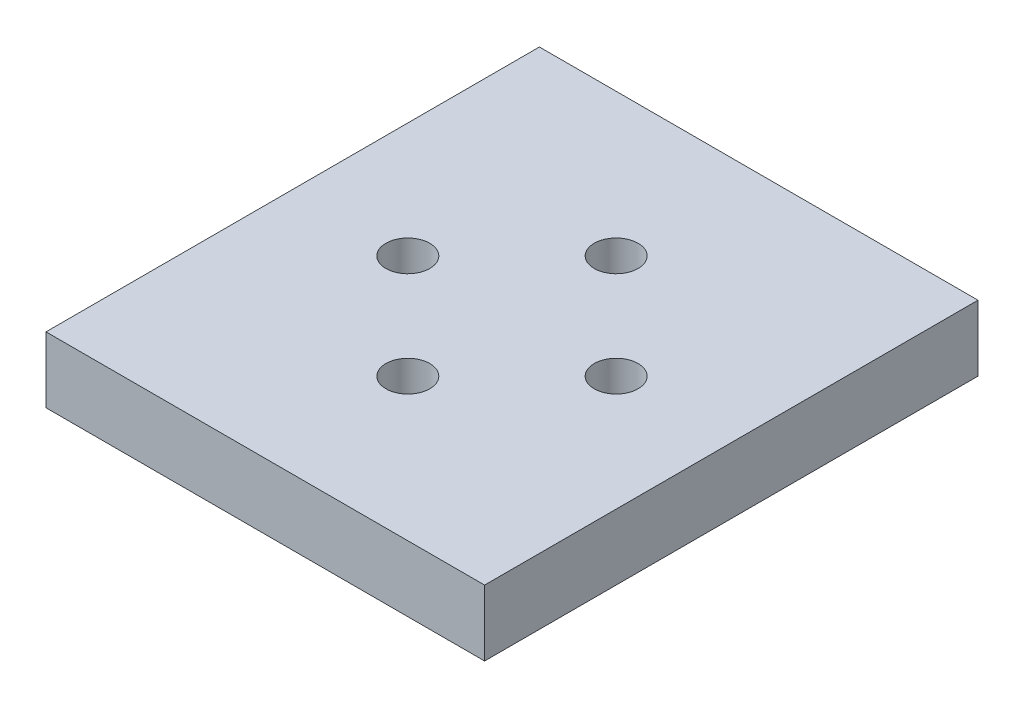
ISO-10303-21;
HEADER;
FILE_DESCRIPTION(('STEP AP214'),'2;1');
FILE_NAME('part.step','',(''),(''),'','','');
FILE_SCHEMA(('AUTOMOTIVE_DESIGN { 1 0 10303 214 1 1 1 1 }'));
ENDSEC;
DATA;
#1=APPLICATION_CONTEXT('core data for automotive mechanical design processes');
#2=APPLICATION_PROTOCOL_DEFINITION('international standard','automotive_design',2000,#1);
#3=PRODUCT_CONTEXT('',#1,'mechanical');
#4=PRODUCT('Part','Part','',(#3));
#5=PRODUCT_RELATED_PRODUCT_CATEGORY('part','',(#4));
#6=PRODUCT_DEFINITION_FORMATION('','',#4);
#7=PRODUCT_DEFINITION_CONTEXT('part definition',#1,'design');
#8=PRODUCT_DEFINITION('design','',#6,#7);
#9=PRODUCT_DEFINITION_SHAPE('','',#8);
#10=(LENGTH_UNIT() NAMED_UNIT(*) SI_UNIT(.MILLI.,.METRE.));
#11=(NAMED_UNIT(*) PLANE_ANGLE_UNIT() SI_UNIT($,.RADIAN.));
#12=(NAMED_UNIT(*) SI_UNIT($,.STERADIAN.) SOLID_ANGLE_UNIT());
#13=UNCERTAINTY_MEASURE_WITH_UNIT(LENGTH_MEASURE(1.E-05),#10,'distance_accuracy_value','');
#14=(GEOMETRIC_REPRESENTATION_CONTEXT(3) GLOBAL_UNCERTAINTY_ASSIGNED_CONTEXT((#13)) GLOBAL_UNIT_ASSIGNED_CONTEXT((#10,
#11,#12)) REPRESENTATION_CONTEXT('',''));
#15=CARTESIAN_POINT('',(0.,0.,0.));
#16=DIRECTION('',(0.,0.,1.));
#17=DIRECTION('',(1.,0.,0.));
#18=AXIS2_PLACEMENT_3D('',#15,#16,#17);
#19=CARTESIAN_POINT('',(20.,6.,-22.5));
#20=DIRECTION('',(-1.,0.,0.));
#21=DIRECTION('',(0.,0.,1.));
#22=AXIS2_PLACEMENT_3D('',#19,#20,#21);
#23=PLANE('',#22);
#24=DIRECTION('',(0.,0.,-1.));
#25=VECTOR('',#24,1.);
#26=CARTESIAN_POINT('',(20.,0.,-22.5));
#27=LINE('',#26,#25);
#28=CARTESIAN_POINT('',(20.,0.,22.5));
#29=VERTEX_POINT('',#28);
#30=CARTESIAN_POINT('',(20.,0.,-22.5));
#31=VERTEX_POINT('',#30);
#32=EDGE_CURVE('E96',#29,#31,#27,.T.);
#33=ORIENTED_EDGE('',*,*,#32,.T.);
#34=DIRECTION('',(0.,-1.,0.));
#35=VECTOR('',#34,1.);
#36=CARTESIAN_POINT('',(20.,6.,-22.5));
#37=LINE('',#36,#35);
#38=CARTESIAN_POINT('',(20.,6.,-22.5));
#39=VERTEX_POINT('',#38);
#40=EDGE_CURVE('E11',#39,#31,#37,.T.);
#41=ORIENTED_EDGE('',*,*,#40,.F.);
#42=DIRECTION('',(0.,0.,-1.));
#43=VECTOR('',#42,1.);
#44=CARTESIAN_POINT('',(20.,6.,-22.5));
#45=LINE('',#44,#43);
#46=CARTESIAN_POINT('',(20.,6.,22.5));
#47=VERTEX_POINT('',#46);
#48=EDGE_CURVE('E84',#47,#39,#45,.T.);
#49=ORIENTED_EDGE('',*,*,#48,.F.);
#50=DIRECTION('',(0.,-1.,0.));
#51=VECTOR('',#50,1.);
#52=CARTESIAN_POINT('',(20.,6.,22.5));
#53=LINE('',#52,#51);
#54=EDGE_CURVE('E92',#47,#29,#53,.T.);
#55=ORIENTED_EDGE('',*,*,#54,.T.);
#56=EDGE_LOOP('',(#33,#41,#49,#55));
#57=FACE_BOUND('',#56,.T.);
#58=ADVANCED_FACE('F33',(#57),#23,.F.);
#59=CARTESIAN_POINT('',(-20.,6.,-22.5));
#60=DIRECTION('',(0.,0.,1.));
#61=DIRECTION('',(1.,0.,0.));
#62=AXIS2_PLACEMENT_3D('',#59,#60,#61);
#63=PLANE('',#62);
#64=DIRECTION('',(-1.,0.,0.));
#65=VECTOR('',#64,1.);
#66=CARTESIAN_POINT('',(-20.,0.,-22.5));
#67=LINE('',#66,#65);
#68=CARTESIAN_POINT('',(-20.,0.,-22.5));
#69=VERTEX_POINT('',#68);
#70=EDGE_CURVE('E88',#31,#69,#67,.T.);
#71=ORIENTED_EDGE('',*,*,#70,.T.);
#72=DIRECTION('',(0.,-1.,0.));
#73=VECTOR('',#72,1.);
#74=CARTESIAN_POINT('',(-20.,6.,-22.5));
#75=LINE('',#74,#73);
#76=CARTESIAN_POINT('',(-20.,6.,-22.5));
#77=VERTEX_POINT('',#76);
#78=EDGE_CURVE('E41',#77,#69,#75,.T.);
#79=ORIENTED_EDGE('',*,*,#78,.F.);
#80=DIRECTION('',(-1.,0.,0.));
#81=VECTOR('',#80,1.);
#82=CARTESIAN_POINT('',(-20.,6.,-22.5));
#83=LINE('',#82,#81);
#84=EDGE_CURVE('E79',#39,#77,#83,.T.);
#85=ORIENTED_EDGE('',*,*,#84,.F.);
#86=ORIENTED_EDGE('',*,*,#40,.T.);
#87=EDGE_LOOP('',(#71,#79,#85,#86));
#88=FACE_BOUND('',#87,.T.);
#89=ADVANCED_FACE('F87',(#88),#63,.F.);
#90=CARTESIAN_POINT('',(-20.,6.,-22.5));
#91=DIRECTION('',(1.,0.,0.));
#92=DIRECTION('',(0.,0.,-1.));
#93=AXIS2_PLACEMENT_3D('',#90,#91,#92);
#94=PLANE('',#93);
#95=DIRECTION('',(0.,0.,1.));
#96=VECTOR('',#95,1.);
#97=CARTESIAN_POINT('',(-20.,0.,-22.5));
#98=LINE('',#97,#96);
#99=CARTESIAN_POINT('',(-20.,0.,22.5));
#100=VERTEX_POINT('',#99);
#101=EDGE_CURVE('E66',#69,#100,#98,.T.);
#102=ORIENTED_EDGE('',*,*,#101,.T.);
#103=DIRECTION('',(0.,-1.,0.));
#104=VECTOR('',#103,1.);
#105=CARTESIAN_POINT('',(-20.,6.,22.5));
#106=LINE('',#105,#104);
#107=CARTESIAN_POINT('',(-20.,6.,22.5));
#108=VERTEX_POINT('',#107);
#109=EDGE_CURVE('E89',#108,#100,#106,.T.);
#110=ORIENTED_EDGE('',*,*,#109,.F.);
#111=DIRECTION('',(0.,0.,1.));
#112=VECTOR('',#111,1.);
#113=CARTESIAN_POINT('',(-20.,6.,-22.5));
#114=LINE('',#113,#112);
#115=EDGE_CURVE('E82',#77,#108,#114,.T.);
#116=ORIENTED_EDGE('',*,*,#115,.F.);
#117=ORIENTED_EDGE('',*,*,#78,.T.);
#118=EDGE_LOOP('',(#102,#110,#116,#117));
#119=FACE_BOUND('',#118,.T.);
#120=ADVANCED_FACE('F90',(#119),#94,.F.);
#121=CARTESIAN_POINT('',(-20.,6.,22.5));
#122=DIRECTION('',(0.,0.,-1.));
#123=DIRECTION('',(-1.,0.,0.));
#124=AXIS2_PLACEMENT_3D('',#121,#122,#123);
#125=PLANE('',#124);
#126=DIRECTION('',(1.,0.,0.));
#127=VECTOR('',#126,1.);
#128=CARTESIAN_POINT('',(-20.,0.,22.5));
#129=LINE('',#128,#127);
#130=EDGE_CURVE('E72',#100,#29,#129,.T.);
#131=ORIENTED_EDGE('',*,*,#130,.T.);
#132=ORIENTED_EDGE('',*,*,#54,.F.);
#133=DIRECTION('',(1.,0.,0.));
#134=VECTOR('',#133,1.);
#135=CARTESIAN_POINT('',(-20.,6.,22.5));
#136=LINE('',#135,#134);
#137=EDGE_CURVE('E49',#108,#47,#136,.T.);
#138=ORIENTED_EDGE('',*,*,#137,.F.);
#139=ORIENTED_EDGE('',*,*,#109,.T.);
#140=EDGE_LOOP('',(#131,#132,#138,#139));
#141=FACE_BOUND('',#140,.T.);
#142=ADVANCED_FACE('F104',(#141),#125,.F.);
#143=CARTESIAN_POINT('',(0.,6.,0.));
#144=DIRECTION('',(0.,1.,0.));
#145=DIRECTION('',(0.,0.,1.));
#146=AXIS2_PLACEMENT_3D('',#143,#144,#145);
#147=PLANE('',#146);
#148=CARTESIAN_POINT('',(-9.49999999999999,6.,0.));
#149=DIRECTION('',(0.,1.,0.));
#150=DIRECTION('',(0.,0.,1.));
#151=AXIS2_PLACEMENT_3D('',#148,#149,#150);
#152=CIRCLE('',#151,2.);
#153=CARTESIAN_POINT('',(-9.49999999999999,6.,2.));
#154=VERTEX_POINT('',#153);
#155=EDGE_CURVE('E128',#154,#154,#152,.T.);
#156=ORIENTED_EDGE('',*,*,#155,.F.);
#157=EDGE_LOOP('',(#156));
#158=FACE_BOUND('',#157,.T.);
#159=CARTESIAN_POINT('',(0.,6.,9.5));
#160=DIRECTION('',(0.,1.,0.));
#161=DIRECTION('',(0.,0.,1.));
#162=AXIS2_PLACEMENT_3D('',#159,#160,#161);
#163=CIRCLE('',#162,2.);
#164=CARTESIAN_POINT('',(0.,6.,11.5));
#165=VERTEX_POINT('',#164);
#166=EDGE_CURVE('E122',#165,#165,#163,.T.);
#167=ORIENTED_EDGE('',*,*,#166,.F.);
#168=EDGE_LOOP('',(#167));
#169=FACE_BOUND('',#168,.T.);
#170=CARTESIAN_POINT('',(9.50000000000001,6.,0.));
#171=DIRECTION('',(0.,1.,0.));
#172=DIRECTION('',(0.,0.,1.));
#173=AXIS2_PLACEMENT_3D('',#170,#171,#172);
#174=CIRCLE('',#173,2.);
#175=CARTESIAN_POINT('',(9.50000000000001,6.,2.));
#176=VERTEX_POINT('',#175);
#177=EDGE_CURVE('E116',#176,#176,#174,.T.);
#178=ORIENTED_EDGE('',*,*,#177,.F.);
#179=EDGE_LOOP('',(#178));
#180=FACE_BOUND('',#179,.T.);
#181=CARTESIAN_POINT('',(0.,6.,-9.5));
#182=DIRECTION('',(0.,1.,0.));
#183=DIRECTION('',(0.,0.,1.));
#184=AXIS2_PLACEMENT_3D('',#181,#182,#183);
#185=CIRCLE('',#184,2.);
#186=CARTESIAN_POINT('',(0.,6.,-7.5));
#187=VERTEX_POINT('',#186);
#188=EDGE_CURVE('E110',#187,#187,#185,.T.);
#189=ORIENTED_EDGE('',*,*,#188,.F.);
#190=EDGE_LOOP('',(#189));
#191=FACE_BOUND('',#190,.T.);
#192=ORIENTED_EDGE('',*,*,#48,.T.);
#193=ORIENTED_EDGE('',*,*,#84,.T.);
#194=ORIENTED_EDGE('',*,*,#115,.T.);
#195=ORIENTED_EDGE('',*,*,#137,.T.);
#196=EDGE_LOOP('',(#192,#193,#194,#195));
#197=FACE_BOUND('',#196,.T.);
#198=ADVANCED_FACE('F80',(#158,#169,#180,#191,#197),#147,.T.);
#199=CARTESIAN_POINT('',(0.,0.,0.));
#200=DIRECTION('',(0.,1.,0.));
#201=DIRECTION('',(0.,0.,1.));
#202=AXIS2_PLACEMENT_3D('',#199,#200,#201);
#203=PLANE('',#202);
#204=CARTESIAN_POINT('',(-9.49999999999999,0.,0.));
#205=DIRECTION('',(0.,1.,0.));
#206=DIRECTION('',(0.,0.,1.));
#207=AXIS2_PLACEMENT_3D('',#204,#205,#206);
#208=CIRCLE('',#207,2.);
#209=CARTESIAN_POINT('',(-9.49999999999999,0.,2.));
#210=VERTEX_POINT('',#209);
#211=EDGE_CURVE('E125',#210,#210,#208,.T.);
#212=ORIENTED_EDGE('',*,*,#211,.T.);
#213=EDGE_LOOP('',(#212));
#214=FACE_BOUND('',#213,.T.);
#215=CARTESIAN_POINT('',(0.,0.,9.5));
#216=DIRECTION('',(0.,1.,0.));
#217=DIRECTION('',(0.,0.,1.));
#218=AXIS2_PLACEMENT_3D('',#215,#216,#217);
#219=CIRCLE('',#218,2.);
#220=CARTESIAN_POINT('',(0.,0.,11.5));
#221=VERTEX_POINT('',#220);
#222=EDGE_CURVE('E119',#221,#221,#219,.T.);
#223=ORIENTED_EDGE('',*,*,#222,.T.);
#224=EDGE_LOOP('',(#223));
#225=FACE_BOUND('',#224,.T.);
#226=CARTESIAN_POINT('',(9.50000000000001,0.,0.));
#227=DIRECTION('',(0.,1.,0.));
#228=DIRECTION('',(0.,0.,1.));
#229=AXIS2_PLACEMENT_3D('',#226,#227,#228);
#230=CIRCLE('',#229,2.);
#231=CARTESIAN_POINT('',(9.50000000000001,0.,2.));
#232=VERTEX_POINT('',#231);
#233=EDGE_CURVE('E113',#232,#232,#230,.T.);
#234=ORIENTED_EDGE('',*,*,#233,.T.);
#235=EDGE_LOOP('',(#234));
#236=FACE_BOUND('',#235,.T.);
#237=CARTESIAN_POINT('',(0.,0.,-9.5));
#238=DIRECTION('',(0.,1.,0.));
#239=DIRECTION('',(0.,0.,1.));
#240=AXIS2_PLACEMENT_3D('',#237,#238,#239);
#241=CIRCLE('',#240,2.);
#242=CARTESIAN_POINT('',(0.,0.,-7.5));
#243=VERTEX_POINT('',#242);
#244=EDGE_CURVE('E99',#243,#243,#241,.T.);
#245=ORIENTED_EDGE('',*,*,#244,.T.);
#246=EDGE_LOOP('',(#245));
#247=FACE_BOUND('',#246,.T.);
#248=ORIENTED_EDGE('',*,*,#32,.F.);
#249=ORIENTED_EDGE('',*,*,#130,.F.);
#250=ORIENTED_EDGE('',*,*,#101,.F.);
#251=ORIENTED_EDGE('',*,*,#70,.F.);
#252=EDGE_LOOP('',(#248,#249,#250,#251));
#253=FACE_BOUND('',#252,.T.);
#254=ADVANCED_FACE('F107',(#214,#225,#236,#247,#253),#203,.F.);
#255=CARTESIAN_POINT('',(0.,0.,-9.5));
#256=DIRECTION('',(0.,1.,0.));
#257=DIRECTION('',(0.,0.,1.));
#258=AXIS2_PLACEMENT_3D('',#255,#256,#257);
#259=CYLINDRICAL_SURFACE('',#258,2.);
#260=ORIENTED_EDGE('',*,*,#244,.F.);
#261=EDGE_LOOP('',(#260));
#262=FACE_BOUND('',#261,.T.);
#263=ORIENTED_EDGE('',*,*,#188,.T.);
#264=EDGE_LOOP('',(#263));
#265=FACE_BOUND('',#264,.T.);
#266=ADVANCED_FACE('F152',(#262,#265),#259,.F.);
#267=CARTESIAN_POINT('',(9.50000000000001,0.,0.));
#268=DIRECTION('',(0.,1.,0.));
#269=DIRECTION('',(0.,0.,1.));
#270=AXIS2_PLACEMENT_3D('',#267,#268,#269);
#271=CYLINDRICAL_SURFACE('',#270,2.);
#272=ORIENTED_EDGE('',*,*,#233,.F.);
#273=EDGE_LOOP('',(#272));
#274=FACE_BOUND('',#273,.T.);
#275=ORIENTED_EDGE('',*,*,#177,.T.);
#276=EDGE_LOOP('',(#275));
#277=FACE_BOUND('',#276,.T.);
#278=ADVANCED_FACE('F154',(#274,#277),#271,.F.);
#279=CARTESIAN_POINT('',(0.,0.,9.5));
#280=DIRECTION('',(0.,1.,0.));
#281=DIRECTION('',(0.,0.,1.));
#282=AXIS2_PLACEMENT_3D('',#279,#280,#281);
#283=CYLINDRICAL_SURFACE('',#282,2.);
#284=ORIENTED_EDGE('',*,*,#222,.F.);
#285=EDGE_LOOP('',(#284));
#286=FACE_BOUND('',#285,.T.);
#287=ORIENTED_EDGE('',*,*,#166,.T.);
#288=EDGE_LOOP('',(#287));
#289=FACE_BOUND('',#288,.T.);
#290=ADVANCED_FACE('F139',(#286,#289),#283,.F.);
#291=CARTESIAN_POINT('',(-9.49999999999999,0.,0.));
#292=DIRECTION('',(0.,1.,0.));
#293=DIRECTION('',(0.,0.,1.));
#294=AXIS2_PLACEMENT_3D('',#291,#292,#293);
#295=CYLINDRICAL_SURFACE('',#294,2.);
#296=ORIENTED_EDGE('',*,*,#211,.F.);
#297=EDGE_LOOP('',(#296));
#298=FACE_BOUND('',#297,.T.);
#299=ORIENTED_EDGE('',*,*,#155,.T.);
#300=EDGE_LOOP('',(#299));
#301=FACE_BOUND('',#300,.T.);
#302=ADVANCED_FACE('F136',(#298,#301),#295,.F.);
#303=CLOSED_SHELL('',(#58,#89,#120,#142,#198,#254,#266,#278,#290,#302));
#304=MANIFOLD_SOLID_BREP('B2',#303);
#305=ADVANCED_BREP_SHAPE_REPRESENTATION('',(#18,#304),#14);
#306=SHAPE_DEFINITION_REPRESENTATION(#9,#305);
ENDSEC;
END-ISO-10303-21;
